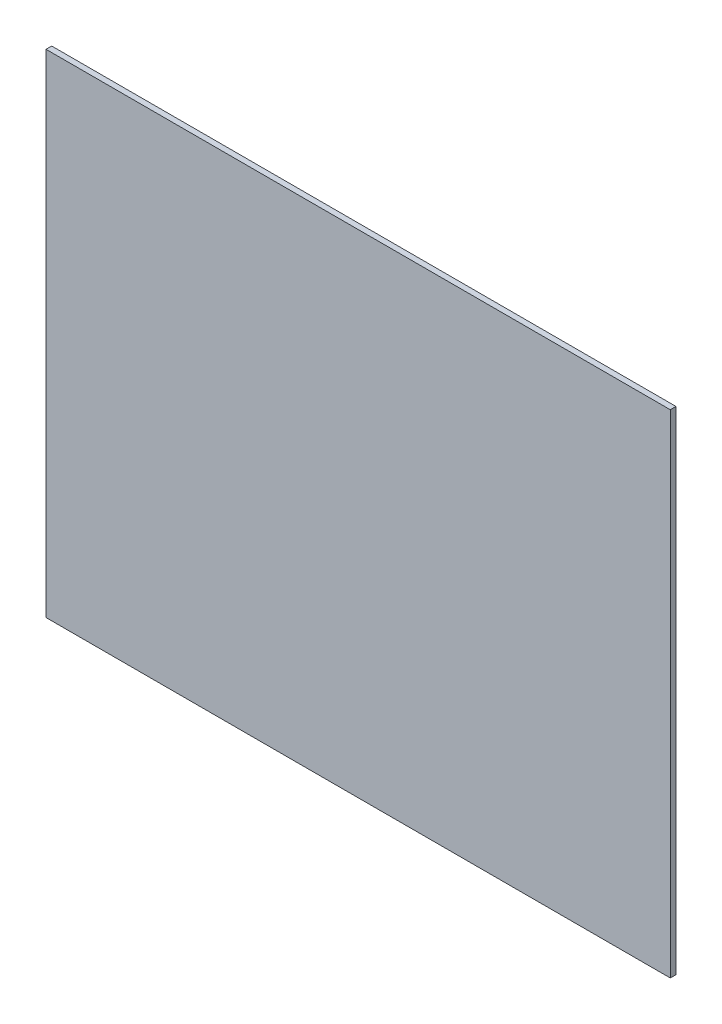
ISO-10303-21;
HEADER;
FILE_DESCRIPTION(('STEP AP214'),'2;1');
FILE_NAME('part.step','',(''),(''),'','','');
FILE_SCHEMA(('AUTOMOTIVE_DESIGN { 1 0 10303 214 1 1 1 1 }'));
ENDSEC;
DATA;
#1=APPLICATION_CONTEXT('core data for automotive mechanical design processes');
#2=APPLICATION_PROTOCOL_DEFINITION('international standard','automotive_design',2000,#1);
#3=PRODUCT_CONTEXT('',#1,'mechanical');
#4=PRODUCT('Part','Part','',(#3));
#5=PRODUCT_RELATED_PRODUCT_CATEGORY('part','',(#4));
#6=PRODUCT_DEFINITION_FORMATION('','',#4);
#7=PRODUCT_DEFINITION_CONTEXT('part definition',#1,'design');
#8=PRODUCT_DEFINITION('design','',#6,#7);
#9=PRODUCT_DEFINITION_SHAPE('','',#8);
#10=(LENGTH_UNIT() NAMED_UNIT(*) SI_UNIT(.MILLI.,.METRE.));
#11=(NAMED_UNIT(*) PLANE_ANGLE_UNIT() SI_UNIT($,.RADIAN.));
#12=(NAMED_UNIT(*) SI_UNIT($,.STERADIAN.) SOLID_ANGLE_UNIT());
#13=UNCERTAINTY_MEASURE_WITH_UNIT(LENGTH_MEASURE(1.E-05),#10,'distance_accuracy_value','');
#14=(GEOMETRIC_REPRESENTATION_CONTEXT(3) GLOBAL_UNCERTAINTY_ASSIGNED_CONTEXT((#13)) GLOBAL_UNIT_ASSIGNED_CONTEXT((#10,
#11,#12)) REPRESENTATION_CONTEXT('',''));
#15=CARTESIAN_POINT('',(0.,0.,0.));
#16=DIRECTION('',(0.,0.,1.));
#17=DIRECTION('',(1.,0.,0.));
#18=AXIS2_PLACEMENT_3D('',#15,#16,#17);
#19=CARTESIAN_POINT('',(-339.299065420561,245.191588785047,5.));
#20=DIRECTION('',(1.,0.,0.));
#21=DIRECTION('',(0.,1.,0.));
#22=AXIS2_PLACEMENT_3D('',#19,#20,#21);
#23=PLANE('',#22);
#24=DIRECTION('',(0.,-1.,0.));
#25=VECTOR('',#24,1.);
#26=CARTESIAN_POINT('',(-339.299065420561,245.191588785047,0.));
#27=LINE('',#26,#25);
#28=CARTESIAN_POINT('',(-339.299065420561,245.191588785047,0.));
#29=VERTEX_POINT('',#28);
#30=CARTESIAN_POINT('',(-339.299065420561,-186.808411214953,0.));
#31=VERTEX_POINT('',#30);
#32=EDGE_CURVE('E99',#29,#31,#27,.T.);
#33=ORIENTED_EDGE('',*,*,#32,.T.);
#34=DIRECTION('',(0.,0.,-1.));
#35=VECTOR('',#34,1.);
#36=CARTESIAN_POINT('',(-339.299065420561,-186.808411214953,5.));
#37=LINE('',#36,#35);
#38=CARTESIAN_POINT('',(-339.299065420561,-186.808411214953,5.));
#39=VERTEX_POINT('',#38);
#40=EDGE_CURVE('E11',#39,#31,#37,.T.);
#41=ORIENTED_EDGE('',*,*,#40,.F.);
#42=DIRECTION('',(0.,-1.,0.));
#43=VECTOR('',#42,1.);
#44=CARTESIAN_POINT('',(-339.299065420561,245.191588785047,5.));
#45=LINE('',#44,#43);
#46=CARTESIAN_POINT('',(-339.299065420561,245.191588785047,5.));
#47=VERTEX_POINT('',#46);
#48=EDGE_CURVE('E87',#47,#39,#45,.T.);
#49=ORIENTED_EDGE('',*,*,#48,.F.);
#50=DIRECTION('',(0.,0.,-1.));
#51=VECTOR('',#50,1.);
#52=CARTESIAN_POINT('',(-339.299065420561,245.191588785047,5.));
#53=LINE('',#52,#51);
#54=EDGE_CURVE('E95',#47,#29,#53,.T.);
#55=ORIENTED_EDGE('',*,*,#54,.T.);
#56=EDGE_LOOP('',(#33,#41,#49,#55));
#57=FACE_BOUND('',#56,.T.);
#58=ADVANCED_FACE('F36',(#57),#23,.F.);
#59=CARTESIAN_POINT('',(-339.299065420561,-186.808411214953,5.));
#60=DIRECTION('',(0.,1.,0.));
#61=DIRECTION('',(0.,0.,1.));
#62=AXIS2_PLACEMENT_3D('',#59,#60,#61);
#63=PLANE('',#62);
#64=DIRECTION('',(1.,0.,0.));
#65=VECTOR('',#64,1.);
#66=CARTESIAN_POINT('',(-339.299065420561,-186.808411214953,0.));
#67=LINE('',#66,#65);
#68=CARTESIAN_POINT('',(208.700934579439,-186.808411214953,0.));
#69=VERTEX_POINT('',#68);
#70=EDGE_CURVE('E91',#31,#69,#67,.T.);
#71=ORIENTED_EDGE('',*,*,#70,.T.);
#72=DIRECTION('',(0.,0.,-1.));
#73=VECTOR('',#72,1.);
#74=CARTESIAN_POINT('',(208.700934579439,-186.808411214953,5.));
#75=LINE('',#74,#73);
#76=CARTESIAN_POINT('',(208.700934579439,-186.808411214953,5.));
#77=VERTEX_POINT('',#76);
#78=EDGE_CURVE('E44',#77,#69,#75,.T.);
#79=ORIENTED_EDGE('',*,*,#78,.F.);
#80=DIRECTION('',(1.,0.,0.));
#81=VECTOR('',#80,1.);
#82=CARTESIAN_POINT('',(-339.299065420561,-186.808411214953,5.));
#83=LINE('',#82,#81);
#84=EDGE_CURVE('E82',#39,#77,#83,.T.);
#85=ORIENTED_EDGE('',*,*,#84,.F.);
#86=ORIENTED_EDGE('',*,*,#40,.T.);
#87=EDGE_LOOP('',(#71,#79,#85,#86));
#88=FACE_BOUND('',#87,.T.);
#89=ADVANCED_FACE('F90',(#88),#63,.F.);
#90=CARTESIAN_POINT('',(208.700934579439,245.191588785047,5.));
#91=DIRECTION('',(-1.,0.,0.));
#92=DIRECTION('',(0.,-1.,0.));
#93=AXIS2_PLACEMENT_3D('',#90,#91,#92);
#94=PLANE('',#93);
#95=DIRECTION('',(0.,1.,0.));
#96=VECTOR('',#95,1.);
#97=CARTESIAN_POINT('',(208.700934579439,245.191588785047,0.));
#98=LINE('',#97,#96);
#99=CARTESIAN_POINT('',(208.700934579439,245.191588785047,0.));
#100=VERTEX_POINT('',#99);
#101=EDGE_CURVE('E69',#69,#100,#98,.T.);
#102=ORIENTED_EDGE('',*,*,#101,.T.);
#103=DIRECTION('',(0.,0.,-1.));
#104=VECTOR('',#103,1.);
#105=CARTESIAN_POINT('',(208.700934579439,245.191588785047,5.));
#106=LINE('',#105,#104);
#107=CARTESIAN_POINT('',(208.700934579439,245.191588785047,5.));
#108=VERTEX_POINT('',#107);
#109=EDGE_CURVE('E92',#108,#100,#106,.T.);
#110=ORIENTED_EDGE('',*,*,#109,.F.);
#111=DIRECTION('',(0.,1.,0.));
#112=VECTOR('',#111,1.);
#113=CARTESIAN_POINT('',(208.700934579439,245.191588785047,5.));
#114=LINE('',#113,#112);
#115=EDGE_CURVE('E85',#77,#108,#114,.T.);
#116=ORIENTED_EDGE('',*,*,#115,.F.);
#117=ORIENTED_EDGE('',*,*,#78,.T.);
#118=EDGE_LOOP('',(#102,#110,#116,#117));
#119=FACE_BOUND('',#118,.T.);
#120=ADVANCED_FACE('F93',(#119),#94,.F.);
#121=CARTESIAN_POINT('',(-339.299065420561,245.191588785047,5.));
#122=DIRECTION('',(0.,-1.,0.));
#123=DIRECTION('',(0.,0.,-1.));
#124=AXIS2_PLACEMENT_3D('',#121,#122,#123);
#125=PLANE('',#124);
#126=DIRECTION('',(-1.,0.,0.));
#127=VECTOR('',#126,1.);
#128=CARTESIAN_POINT('',(-339.299065420561,245.191588785047,0.));
#129=LINE('',#128,#127);
#130=EDGE_CURVE('E75',#100,#29,#129,.T.);
#131=ORIENTED_EDGE('',*,*,#130,.T.);
#132=ORIENTED_EDGE('',*,*,#54,.F.);
#133=DIRECTION('',(-1.,0.,0.));
#134=VECTOR('',#133,1.);
#135=CARTESIAN_POINT('',(-339.299065420561,245.191588785047,5.));
#136=LINE('',#135,#134);
#137=EDGE_CURVE('E52',#108,#47,#136,.T.);
#138=ORIENTED_EDGE('',*,*,#137,.F.);
#139=ORIENTED_EDGE('',*,*,#109,.T.);
#140=EDGE_LOOP('',(#131,#132,#138,#139));
#141=FACE_BOUND('',#140,.T.);
#142=ADVANCED_FACE('F106',(#141),#125,.F.);
#143=CARTESIAN_POINT('',(0.,0.,5.));
#144=DIRECTION('',(0.,0.,1.));
#145=DIRECTION('',(1.,0.,0.));
#146=AXIS2_PLACEMENT_3D('',#143,#144,#145);
#147=PLANE('',#146);
#148=ORIENTED_EDGE('',*,*,#48,.T.);
#149=ORIENTED_EDGE('',*,*,#84,.T.);
#150=ORIENTED_EDGE('',*,*,#115,.T.);
#151=ORIENTED_EDGE('',*,*,#137,.T.);
#152=EDGE_LOOP('',(#148,#149,#150,#151));
#153=FACE_BOUND('',#152,.T.);
#154=ADVANCED_FACE('F83',(#153),#147,.T.);
#155=CARTESIAN_POINT('',(0.,0.,0.));
#156=DIRECTION('',(0.,0.,1.));
#157=DIRECTION('',(1.,0.,0.));
#158=AXIS2_PLACEMENT_3D('',#155,#156,#157);
#159=PLANE('',#158);
#160=ORIENTED_EDGE('',*,*,#32,.F.);
#161=ORIENTED_EDGE('',*,*,#130,.F.);
#162=ORIENTED_EDGE('',*,*,#101,.F.);
#163=ORIENTED_EDGE('',*,*,#70,.F.);
#164=EDGE_LOOP('',(#160,#161,#162,#163));
#165=FACE_BOUND('',#164,.T.);
#166=ADVANCED_FACE('F109',(#165),#159,.F.);
#167=CLOSED_SHELL('',(#58,#89,#120,#142,#154,#166));
#168=MANIFOLD_SOLID_BREP('B2',#167);
#169=ADVANCED_BREP_SHAPE_REPRESENTATION('',(#18,#168),#14);
#170=SHAPE_DEFINITION_REPRESENTATION(#9,#169);
ENDSEC;
END-ISO-10303-21;
